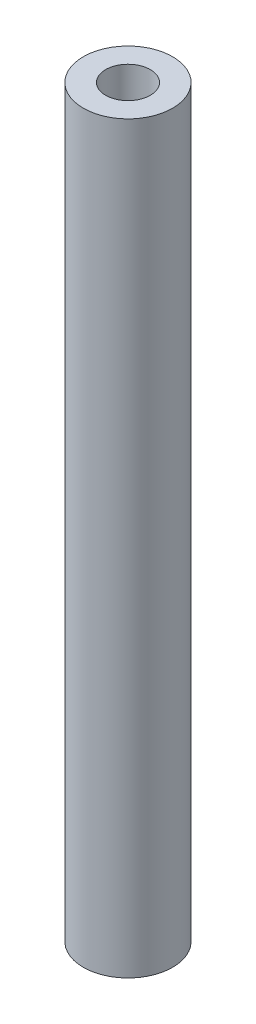
ISO-10303-21;
HEADER;
FILE_DESCRIPTION(('STEP AP214'),'2;1');
FILE_NAME('part.step','',(''),(''),'','','');
FILE_SCHEMA(('AUTOMOTIVE_DESIGN { 1 0 10303 214 1 1 1 1 }'));
ENDSEC;
DATA;
#1=APPLICATION_CONTEXT('core data for automotive mechanical design processes');
#2=APPLICATION_PROTOCOL_DEFINITION('international standard','automotive_design',2000,#1);
#3=PRODUCT_CONTEXT('',#1,'mechanical');
#4=PRODUCT('Part','Part','',(#3));
#5=PRODUCT_RELATED_PRODUCT_CATEGORY('part','',(#4));
#6=PRODUCT_DEFINITION_FORMATION('','',#4);
#7=PRODUCT_DEFINITION_CONTEXT('part definition',#1,'design');
#8=PRODUCT_DEFINITION('design','',#6,#7);
#9=PRODUCT_DEFINITION_SHAPE('','',#8);
#10=(LENGTH_UNIT() NAMED_UNIT(*) SI_UNIT(.MILLI.,.METRE.));
#11=(NAMED_UNIT(*) PLANE_ANGLE_UNIT() SI_UNIT($,.RADIAN.));
#12=(NAMED_UNIT(*) SI_UNIT($,.STERADIAN.) SOLID_ANGLE_UNIT());
#13=UNCERTAINTY_MEASURE_WITH_UNIT(LENGTH_MEASURE(1.E-05),#10,'distance_accuracy_value','');
#14=(GEOMETRIC_REPRESENTATION_CONTEXT(3) GLOBAL_UNCERTAINTY_ASSIGNED_CONTEXT((#13)) GLOBAL_UNIT_ASSIGNED_CONTEXT((#10,
#11,#12)) REPRESENTATION_CONTEXT('',''));
#15=CARTESIAN_POINT('',(0.,0.,0.));
#16=DIRECTION('',(0.,0.,1.));
#17=DIRECTION('',(1.,0.,0.));
#18=AXIS2_PLACEMENT_3D('',#15,#16,#17);
#19=CARTESIAN_POINT('',(0.,50.,0.));
#20=DIRECTION('',(0.,1.,0.));
#21=DIRECTION('',(0.,0.,1.));
#22=AXIS2_PLACEMENT_3D('',#19,#20,#21);
#23=PLANE('',#22);
#24=CARTESIAN_POINT('',(0.,50.,0.));
#25=DIRECTION('',(0.,1.,0.));
#26=DIRECTION('',(0.,0.,1.));
#27=AXIS2_PLACEMENT_3D('',#24,#25,#26);
#28=CIRCLE('',#27,3.);
#29=CARTESIAN_POINT('',(0.,50.,3.));
#30=VERTEX_POINT('',#29);
#31=EDGE_CURVE('E10',#30,#30,#28,.T.);
#32=ORIENTED_EDGE('',*,*,#31,.T.);
#33=EDGE_LOOP('',(#32));
#34=FACE_BOUND('',#33,.T.);
#35=CARTESIAN_POINT('',(0.,50.,0.));
#36=DIRECTION('',(0.,1.,0.));
#37=DIRECTION('',(0.,0.,1.));
#38=AXIS2_PLACEMENT_3D('',#35,#36,#37);
#39=CIRCLE('',#38,1.5);
#40=CARTESIAN_POINT('',(0.,50.,1.5));
#41=VERTEX_POINT('',#40);
#42=EDGE_CURVE('E47',#41,#41,#39,.T.);
#43=ORIENTED_EDGE('',*,*,#42,.F.);
#44=EDGE_LOOP('',(#43));
#45=FACE_BOUND('',#44,.T.);
#46=ADVANCED_FACE('F36',(#34,#45),#23,.T.);
#47=CARTESIAN_POINT('',(0.,0.,0.));
#48=DIRECTION('',(0.,1.,0.));
#49=DIRECTION('',(0.,0.,1.));
#50=AXIS2_PLACEMENT_3D('',#47,#48,#49);
#51=PLANE('',#50);
#52=CARTESIAN_POINT('',(0.,0.,0.));
#53=DIRECTION('',(0.,1.,0.));
#54=DIRECTION('',(0.,0.,1.));
#55=AXIS2_PLACEMENT_3D('',#52,#53,#54);
#56=CIRCLE('',#55,3.);
#57=CARTESIAN_POINT('',(0.,0.,3.));
#58=VERTEX_POINT('',#57);
#59=EDGE_CURVE('E45',#58,#58,#56,.T.);
#60=ORIENTED_EDGE('',*,*,#59,.F.);
#61=EDGE_LOOP('',(#60));
#62=FACE_BOUND('',#61,.T.);
#63=CARTESIAN_POINT('',(0.,0.,0.));
#64=DIRECTION('',(0.,1.,0.));
#65=DIRECTION('',(0.,0.,1.));
#66=AXIS2_PLACEMENT_3D('',#63,#64,#65);
#67=CIRCLE('',#66,1.5);
#68=CARTESIAN_POINT('',(0.,0.,1.5));
#69=VERTEX_POINT('',#68);
#70=EDGE_CURVE('E51',#69,#69,#67,.T.);
#71=ORIENTED_EDGE('',*,*,#70,.T.);
#72=EDGE_LOOP('',(#71));
#73=FACE_BOUND('',#72,.T.);
#74=ADVANCED_FACE('F61',(#62,#73),#51,.F.);
#75=CARTESIAN_POINT('',(0.,50.,0.));
#76=DIRECTION('',(0.,-1.,0.));
#77=DIRECTION('',(0.,0.,-1.));
#78=AXIS2_PLACEMENT_3D('',#75,#76,#77);
#79=CYLINDRICAL_SURFACE('',#78,3.);
#80=ORIENTED_EDGE('',*,*,#31,.F.);
#81=EDGE_LOOP('',(#80));
#82=FACE_BOUND('',#81,.T.);
#83=ORIENTED_EDGE('',*,*,#59,.T.);
#84=EDGE_LOOP('',(#83));
#85=FACE_BOUND('',#84,.T.);
#86=ADVANCED_FACE('F37',(#82,#85),#79,.T.);
#87=CARTESIAN_POINT('',(0.,50.,0.));
#88=DIRECTION('',(0.,-1.,0.));
#89=DIRECTION('',(0.,0.,-1.));
#90=AXIS2_PLACEMENT_3D('',#87,#88,#89);
#91=CYLINDRICAL_SURFACE('',#90,1.5);
#92=ORIENTED_EDGE('',*,*,#42,.T.);
#93=EDGE_LOOP('',(#92));
#94=FACE_BOUND('',#93,.T.);
#95=ORIENTED_EDGE('',*,*,#70,.F.);
#96=EDGE_LOOP('',(#95));
#97=FACE_BOUND('',#96,.T.);
#98=ADVANCED_FACE('F60',(#94,#97),#91,.F.);
#99=CLOSED_SHELL('',(#46,#74,#86,#98));
#100=MANIFOLD_SOLID_BREP('B2',#99);
#101=ADVANCED_BREP_SHAPE_REPRESENTATION('',(#18,#100),#14);
#102=SHAPE_DEFINITION_REPRESENTATION(#9,#101);
ENDSEC;
END-ISO-10303-21;
